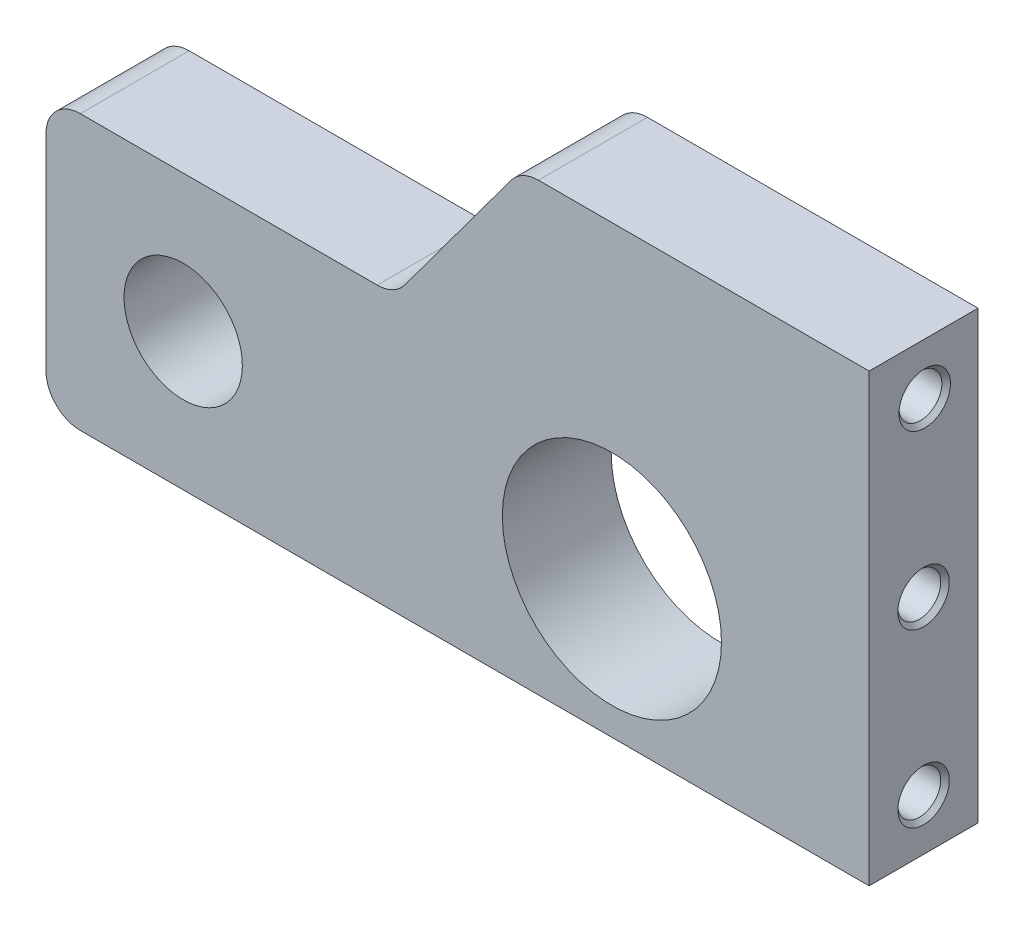
ISO-10303-21;
HEADER;
FILE_DESCRIPTION(('STEP AP214'),'2;1');
FILE_NAME('part.step','',(''),(''),'','','');
FILE_SCHEMA(('AUTOMOTIVE_DESIGN { 1 0 10303 214 1 1 1 1 }'));
ENDSEC;
DATA;
#1=APPLICATION_CONTEXT('core data for automotive mechanical design processes');
#2=APPLICATION_PROTOCOL_DEFINITION('international standard','automotive_design',2000,#1);
#3=PRODUCT_CONTEXT('',#1,'mechanical');
#4=PRODUCT('Part','Part','',(#3));
#5=PRODUCT_RELATED_PRODUCT_CATEGORY('part','',(#4));
#6=PRODUCT_DEFINITION_FORMATION('','',#4);
#7=PRODUCT_DEFINITION_CONTEXT('part definition',#1,'design');
#8=PRODUCT_DEFINITION('design','',#6,#7);
#9=PRODUCT_DEFINITION_SHAPE('','',#8);
#10=(LENGTH_UNIT() NAMED_UNIT(*) SI_UNIT(.MILLI.,.METRE.));
#11=(NAMED_UNIT(*) PLANE_ANGLE_UNIT() SI_UNIT($,.RADIAN.));
#12=(NAMED_UNIT(*) SI_UNIT($,.STERADIAN.) SOLID_ANGLE_UNIT());
#13=UNCERTAINTY_MEASURE_WITH_UNIT(LENGTH_MEASURE(1.E-05),#10,'distance_accuracy_value','');
#14=(GEOMETRIC_REPRESENTATION_CONTEXT(3) GLOBAL_UNCERTAINTY_ASSIGNED_CONTEXT((#13)) GLOBAL_UNIT_ASSIGNED_CONTEXT((#10,
#11,#12)) REPRESENTATION_CONTEXT('',''));
#15=CARTESIAN_POINT('',(0.,0.,0.));
#16=DIRECTION('',(0.,0.,1.));
#17=DIRECTION('',(1.,0.,0.));
#18=AXIS2_PLACEMENT_3D('',#15,#16,#17);
#19=CARTESIAN_POINT('',(0.,0.,6.35));
#20=DIRECTION('',(-1.,0.,0.));
#21=DIRECTION('',(0.,-1.,0.));
#22=AXIS2_PLACEMENT_3D('',#19,#20,#21);
#23=PLANE('',#22);
#24=DIRECTION('',(0.,1.,0.));
#25=VECTOR('',#24,1.);
#26=CARTESIAN_POINT('',(0.,0.,6.35));
#27=LINE('',#26,#25);
#28=CARTESIAN_POINT('',(0.,2.,6.35));
#29=VERTEX_POINT('',#28);
#30=CARTESIAN_POINT('',(0.,14.,6.35));
#31=VERTEX_POINT('',#30);
#32=EDGE_CURVE('E204',#29,#31,#27,.T.);
#33=ORIENTED_EDGE('',*,*,#32,.T.);
#34=DIRECTION('',(0.,0.,-1.));
#35=VECTOR('',#34,1.);
#36=CARTESIAN_POINT('',(0.,14.,6.35));
#37=LINE('',#36,#35);
#38=CARTESIAN_POINT('',(0.,14.,0.));
#39=VERTEX_POINT('',#38);
#40=EDGE_CURVE('E231',#31,#39,#37,.T.);
#41=ORIENTED_EDGE('',*,*,#40,.T.);
#42=DIRECTION('',(0.,1.,0.));
#43=VECTOR('',#42,1.);
#44=CARTESIAN_POINT('',(0.,0.,0.));
#45=LINE('',#44,#43);
#46=CARTESIAN_POINT('',(0.,2.,0.));
#47=VERTEX_POINT('',#46);
#48=EDGE_CURVE('E192',#47,#39,#45,.T.);
#49=ORIENTED_EDGE('',*,*,#48,.F.);
#50=DIRECTION('',(0.,0.,-1.));
#51=VECTOR('',#50,1.);
#52=CARTESIAN_POINT('',(0.,2.,6.35));
#53=LINE('',#52,#51);
#54=EDGE_CURVE('E228',#47,#29,#53,.F.);
#55=ORIENTED_EDGE('',*,*,#54,.T.);
#56=EDGE_LOOP('',(#33,#41,#49,#55));
#57=FACE_BOUND('',#56,.T.);
#58=ADVANCED_FACE('F66',(#57),#23,.T.);
#59=CARTESIAN_POINT('',(0.,0.,6.35));
#60=DIRECTION('',(0.,1.,0.));
#61=DIRECTION('',(-1.,0.,0.));
#62=AXIS2_PLACEMENT_3D('',#59,#60,#61);
#63=PLANE('',#62);
#64=DIRECTION('',(1.,0.,0.));
#65=VECTOR('',#64,1.);
#66=CARTESIAN_POINT('',(0.,0.,6.35));
#67=LINE('',#66,#65);
#68=CARTESIAN_POINT('',(2.,0.,6.35));
#69=VERTEX_POINT('',#68);
#70=CARTESIAN_POINT('',(48.,0.,6.35));
#71=VERTEX_POINT('',#70);
#72=EDGE_CURVE('E215',#69,#71,#67,.T.);
#73=ORIENTED_EDGE('',*,*,#72,.F.);
#74=DIRECTION('',(0.,0.,-1.));
#75=VECTOR('',#74,1.);
#76=CARTESIAN_POINT('',(2.,0.,0.));
#77=LINE('',#76,#75);
#78=CARTESIAN_POINT('',(2.,0.,0.));
#79=VERTEX_POINT('',#78);
#80=EDGE_CURVE('E250',#69,#79,#77,.T.);
#81=ORIENTED_EDGE('',*,*,#80,.T.);
#82=DIRECTION('',(1.,0.,0.));
#83=VECTOR('',#82,1.);
#84=CARTESIAN_POINT('',(0.,0.,0.));
#85=LINE('',#84,#83);
#86=CARTESIAN_POINT('',(48.,0.,0.));
#87=VERTEX_POINT('',#86);
#88=EDGE_CURVE('E158',#79,#87,#85,.T.);
#89=ORIENTED_EDGE('',*,*,#88,.T.);
#90=DIRECTION('',(0.,0.,-1.));
#91=VECTOR('',#90,1.);
#92=CARTESIAN_POINT('',(48.,0.,6.35));
#93=LINE('',#92,#91);
#94=EDGE_CURVE('E155',#71,#87,#93,.T.);
#95=ORIENTED_EDGE('',*,*,#94,.F.);
#96=EDGE_LOOP('',(#73,#81,#89,#95));
#97=FACE_BOUND('',#96,.T.);
#98=ADVANCED_FACE('F313',(#97),#63,.F.);
#99=CARTESIAN_POINT('',(48.,0.,6.35));
#100=DIRECTION('',(-1.,0.,0.));
#101=DIRECTION('',(0.,0.,1.));
#102=AXIS2_PLACEMENT_3D('',#99,#100,#101);
#103=PLANE('',#102);
#104=CARTESIAN_POINT('',(48.,3.,3.175));
#105=DIRECTION('',(-1.,0.,0.));
#106=DIRECTION('',(0.,0.,1.));
#107=AXIS2_PLACEMENT_3D('',#104,#105,#106);
#108=CIRCLE('',#107,1.5);
#109=CARTESIAN_POINT('',(48.,3.,4.675));
#110=VERTEX_POINT('',#109);
#111=EDGE_CURVE('E289',#110,#110,#108,.T.);
#112=ORIENTED_EDGE('',*,*,#111,.T.);
#113=EDGE_LOOP('',(#112));
#114=FACE_BOUND('',#113,.T.);
#115=CARTESIAN_POINT('',(48.,13.,3.175));
#116=DIRECTION('',(-1.,0.,0.));
#117=DIRECTION('',(0.,0.,1.));
#118=AXIS2_PLACEMENT_3D('',#115,#116,#117);
#119=CIRCLE('',#118,1.5);
#120=CARTESIAN_POINT('',(48.,13.,4.675));
#121=VERTEX_POINT('',#120);
#122=EDGE_CURVE('E285',#121,#121,#119,.T.);
#123=ORIENTED_EDGE('',*,*,#122,.T.);
#124=EDGE_LOOP('',(#123));
#125=FACE_BOUND('',#124,.T.);
#126=CARTESIAN_POINT('',(48.,23.,3.10572404048079));
#127=DIRECTION('',(-1.,0.,0.));
#128=DIRECTION('',(0.,0.,1.));
#129=AXIS2_PLACEMENT_3D('',#126,#127,#128);
#130=CIRCLE('',#129,1.5);
#131=CARTESIAN_POINT('',(48.,23.,4.6057240404808));
#132=VERTEX_POINT('',#131);
#133=EDGE_CURVE('E281',#132,#132,#130,.T.);
#134=ORIENTED_EDGE('',*,*,#133,.T.);
#135=EDGE_LOOP('',(#134));
#136=FACE_BOUND('',#135,.T.);
#137=DIRECTION('',(0.,1.,0.));
#138=VECTOR('',#137,1.);
#139=CARTESIAN_POINT('',(48.,0.,0.));
#140=LINE('',#139,#138);
#141=CARTESIAN_POINT('',(48.,26.,0.));
#142=VERTEX_POINT('',#141);
#143=EDGE_CURVE('E148',#87,#142,#140,.T.);
#144=ORIENTED_EDGE('',*,*,#143,.T.);
#145=DIRECTION('',(0.,0.,1.));
#146=VECTOR('',#145,1.);
#147=CARTESIAN_POINT('',(48.,26.,0.));
#148=LINE('',#147,#146);
#149=CARTESIAN_POINT('',(48.,26.,6.35));
#150=VERTEX_POINT('',#149);
#151=EDGE_CURVE('E152',#142,#150,#148,.T.);
#152=ORIENTED_EDGE('',*,*,#151,.T.);
#153=DIRECTION('',(0.,1.,0.));
#154=VECTOR('',#153,1.);
#155=CARTESIAN_POINT('',(48.,0.,6.35));
#156=LINE('',#155,#154);
#157=EDGE_CURVE('E212',#71,#150,#156,.T.);
#158=ORIENTED_EDGE('',*,*,#157,.F.);
#159=ORIENTED_EDGE('',*,*,#94,.T.);
#160=EDGE_LOOP('',(#144,#152,#158,#159));
#161=FACE_BOUND('',#160,.T.);
#162=ADVANCED_FACE('F150',(#114,#125,#136,#161),#103,.F.);
#163=CARTESIAN_POINT('',(0.,16.,6.35));
#164=DIRECTION('',(0.,1.,0.));
#165=DIRECTION('',(-1.,0.,0.));
#166=AXIS2_PLACEMENT_3D('',#163,#164,#165);
#167=PLANE('',#166);
#168=DIRECTION('',(1.,0.,0.));
#169=VECTOR('',#168,1.);
#170=CARTESIAN_POINT('',(0.,16.,6.35));
#171=LINE('',#170,#169);
#172=CARTESIAN_POINT('',(2.00000000000001,16.,6.35));
#173=VERTEX_POINT('',#172);
#174=CARTESIAN_POINT('',(19.3170754387709,16.,6.35));
#175=VERTEX_POINT('',#174);
#176=EDGE_CURVE('E208',#173,#175,#171,.T.);
#177=ORIENTED_EDGE('',*,*,#176,.T.);
#178=DIRECTION('',(0.,0.,1.));
#179=VECTOR('',#178,1.);
#180=CARTESIAN_POINT('',(19.3170754387709,16.,0.));
#181=LINE('',#180,#179);
#182=CARTESIAN_POINT('',(19.3170754387709,16.,0.));
#183=VERTEX_POINT('',#182);
#184=EDGE_CURVE('E261',#175,#183,#181,.F.);
#185=ORIENTED_EDGE('',*,*,#184,.T.);
#186=DIRECTION('',(1.,0.,0.));
#187=VECTOR('',#186,1.);
#188=CARTESIAN_POINT('',(0.,16.,0.));
#189=LINE('',#188,#187);
#190=CARTESIAN_POINT('',(2.00000000000001,16.,0.));
#191=VERTEX_POINT('',#190);
#192=EDGE_CURVE('E159',#191,#183,#189,.T.);
#193=ORIENTED_EDGE('',*,*,#192,.F.);
#194=DIRECTION('',(0.,0.,-1.));
#195=VECTOR('',#194,1.);
#196=CARTESIAN_POINT('',(2.00000000000001,16.,6.35));
#197=LINE('',#196,#195);
#198=EDGE_CURVE('E241',#191,#173,#197,.F.);
#199=ORIENTED_EDGE('',*,*,#198,.T.);
#200=EDGE_LOOP('',(#177,#185,#193,#199));
#201=FACE_BOUND('',#200,.T.);
#202=ADVANCED_FACE('F323',(#201),#167,.T.);
#203=CARTESIAN_POINT('',(0.,0.,6.35));
#204=DIRECTION('',(0.,0.,-1.));
#205=DIRECTION('',(-1.,0.,0.));
#206=AXIS2_PLACEMENT_3D('',#203,#204,#205);
#207=PLANE('',#206);
#208=CARTESIAN_POINT('',(8.,8.,6.35));
#209=DIRECTION('',(0.,0.,1.));
#210=DIRECTION('',(1.,0.,0.));
#211=AXIS2_PLACEMENT_3D('',#208,#209,#210);
#212=CIRCLE('',#211,3.45);
#213=CARTESIAN_POINT('',(11.45,8.,6.35));
#214=VERTEX_POINT('',#213);
#215=EDGE_CURVE('E188',#214,#214,#212,.T.);
#216=ORIENTED_EDGE('',*,*,#215,.F.);
#217=EDGE_LOOP('',(#216));
#218=FACE_BOUND('',#217,.T.);
#219=CARTESIAN_POINT('',(33.,7.99999999999999,6.35));
#220=DIRECTION('',(0.,0.,1.));
#221=DIRECTION('',(1.,0.,0.));
#222=AXIS2_PLACEMENT_3D('',#219,#220,#221);
#223=CIRCLE('',#222,6.39);
#224=CARTESIAN_POINT('',(39.39,7.99999999999999,6.35));
#225=VERTEX_POINT('',#224);
#226=EDGE_CURVE('E182',#225,#225,#223,.T.);
#227=ORIENTED_EDGE('',*,*,#226,.F.);
#228=EDGE_LOOP('',(#227));
#229=FACE_BOUND('',#228,.T.);
#230=DIRECTION('',(-1.,0.,0.));
#231=VECTOR('',#230,1.);
#232=CARTESIAN_POINT('',(48.,26.,6.35));
#233=LINE('',#232,#231);
#234=CARTESIAN_POINT('',(28.7212493815809,26.,6.35));
#235=VERTEX_POINT('',#234);
#236=EDGE_CURVE('E165',#150,#235,#233,.T.);
#237=ORIENTED_EDGE('',*,*,#236,.T.);
#238=CARTESIAN_POINT('',(28.7212493815809,24.,6.35));
#239=DIRECTION('',(0.,0.,-1.));
#240=DIRECTION('',(-1.,0.,0.));
#241=AXIS2_PLACEMENT_3D('',#238,#239,#240);
#242=CIRCLE('',#241,2.);
#243=CARTESIAN_POINT('',(27.112470955428,25.1882053591636,6.35));
#244=VERTEX_POINT('',#243);
#245=EDGE_CURVE('E90',#235,#244,#242,.F.);
#246=ORIENTED_EDGE('',*,*,#245,.T.);
#247=DIRECTION('',(-0.594102679581803,-0.804389213076432,0.));
#248=VECTOR('',#247,1.);
#249=CARTESIAN_POINT('',(5.50572150582795,-4.06639453447363,6.35));
#250=LINE('',#249,#248);
#251=CARTESIAN_POINT('',(20.9258538649237,16.8117946408364,6.35));
#252=VERTEX_POINT('',#251);
#253=EDGE_CURVE('E167',#244,#252,#250,.T.);
#254=ORIENTED_EDGE('',*,*,#253,.T.);
#255=CARTESIAN_POINT('',(19.3170754387709,18.,6.35));
#256=DIRECTION('',(0.,0.,-1.));
#257=DIRECTION('',(-1.,0.,0.));
#258=AXIS2_PLACEMENT_3D('',#255,#256,#257);
#259=CIRCLE('',#258,2.);
#260=EDGE_CURVE('E271',#252,#175,#259,.T.);
#261=ORIENTED_EDGE('',*,*,#260,.T.);
#262=ORIENTED_EDGE('',*,*,#176,.F.);
#263=CARTESIAN_POINT('',(2.,14.,6.35));
#264=DIRECTION('',(0.,0.,-1.));
#265=DIRECTION('',(-1.,0.,0.));
#266=AXIS2_PLACEMENT_3D('',#263,#264,#265);
#267=CIRCLE('',#266,2.);
#268=EDGE_CURVE('E247',#173,#31,#267,.F.);
#269=ORIENTED_EDGE('',*,*,#268,.T.);
#270=ORIENTED_EDGE('',*,*,#32,.F.);
#271=CARTESIAN_POINT('',(2.,2.,6.35));
#272=DIRECTION('',(0.,0.,-1.));
#273=DIRECTION('',(-1.,0.,0.));
#274=AXIS2_PLACEMENT_3D('',#271,#272,#273);
#275=CIRCLE('',#274,2.);
#276=EDGE_CURVE('E244',#29,#69,#275,.F.);
#277=ORIENTED_EDGE('',*,*,#276,.T.);
#278=ORIENTED_EDGE('',*,*,#72,.T.);
#279=ORIENTED_EDGE('',*,*,#157,.T.);
#280=EDGE_LOOP('',(#237,#246,#254,#261,#262,#269,#270,#277,#278,#279));
#281=FACE_BOUND('',#280,.T.);
#282=ADVANCED_FACE('F349',(#218,#229,#281),#207,.F.);
#283=CARTESIAN_POINT('',(0.,0.,0.));
#284=DIRECTION('',(0.,0.,-1.));
#285=DIRECTION('',(-1.,0.,0.));
#286=AXIS2_PLACEMENT_3D('',#283,#284,#285);
#287=PLANE('',#286);
#288=CARTESIAN_POINT('',(8.,8.,0.));
#289=DIRECTION('',(0.,0.,1.));
#290=DIRECTION('',(1.,0.,0.));
#291=AXIS2_PLACEMENT_3D('',#288,#289,#290);
#292=CIRCLE('',#291,3.45);
#293=CARTESIAN_POINT('',(11.45,8.,0.));
#294=VERTEX_POINT('',#293);
#295=EDGE_CURVE('E193',#294,#294,#292,.T.);
#296=ORIENTED_EDGE('',*,*,#295,.T.);
#297=EDGE_LOOP('',(#296));
#298=FACE_BOUND('',#297,.T.);
#299=CARTESIAN_POINT('',(33.,7.99999999999999,0.));
#300=DIRECTION('',(0.,0.,1.));
#301=DIRECTION('',(1.,0.,0.));
#302=AXIS2_PLACEMENT_3D('',#299,#300,#301);
#303=CIRCLE('',#302,6.39);
#304=CARTESIAN_POINT('',(39.39,7.99999999999999,0.));
#305=VERTEX_POINT('',#304);
#306=EDGE_CURVE('E197',#305,#305,#303,.T.);
#307=ORIENTED_EDGE('',*,*,#306,.T.);
#308=EDGE_LOOP('',(#307));
#309=FACE_BOUND('',#308,.T.);
#310=DIRECTION('',(-0.594102679581803,-0.804389213076432,0.));
#311=VECTOR('',#310,1.);
#312=CARTESIAN_POINT('',(5.50572150582795,-4.06639453447363,0.));
#313=LINE('',#312,#311);
#314=CARTESIAN_POINT('',(27.112470955428,25.1882053591636,0.));
#315=VERTEX_POINT('',#314);
#316=CARTESIAN_POINT('',(20.9258538649237,16.8117946408364,0.));
#317=VERTEX_POINT('',#316);
#318=EDGE_CURVE('E187',#315,#317,#313,.T.);
#319=ORIENTED_EDGE('',*,*,#318,.F.);
#320=CARTESIAN_POINT('',(28.7212493815809,24.,0.));
#321=DIRECTION('',(0.,0.,-1.));
#322=DIRECTION('',(-1.,0.,0.));
#323=AXIS2_PLACEMENT_3D('',#320,#321,#322);
#324=CIRCLE('',#323,2.);
#325=CARTESIAN_POINT('',(28.7212493815809,26.,0.));
#326=VERTEX_POINT('',#325);
#327=EDGE_CURVE('E82',#315,#326,#324,.T.);
#328=ORIENTED_EDGE('',*,*,#327,.T.);
#329=DIRECTION('',(-1.,0.,0.));
#330=VECTOR('',#329,1.);
#331=CARTESIAN_POINT('',(48.,26.,0.));
#332=LINE('',#331,#330);
#333=EDGE_CURVE('E163',#142,#326,#332,.T.);
#334=ORIENTED_EDGE('',*,*,#333,.F.);
#335=ORIENTED_EDGE('',*,*,#143,.F.);
#336=ORIENTED_EDGE('',*,*,#88,.F.);
#337=CARTESIAN_POINT('',(2.,2.,0.));
#338=DIRECTION('',(0.,0.,-1.));
#339=DIRECTION('',(-1.,0.,0.));
#340=AXIS2_PLACEMENT_3D('',#337,#338,#339);
#341=CIRCLE('',#340,2.);
#342=EDGE_CURVE('E235',#79,#47,#341,.T.);
#343=ORIENTED_EDGE('',*,*,#342,.T.);
#344=ORIENTED_EDGE('',*,*,#48,.T.);
#345=CARTESIAN_POINT('',(2.,14.,0.));
#346=DIRECTION('',(0.,0.,-1.));
#347=DIRECTION('',(-1.,0.,0.));
#348=AXIS2_PLACEMENT_3D('',#345,#346,#347);
#349=CIRCLE('',#348,2.);
#350=EDGE_CURVE('E238',#39,#191,#349,.T.);
#351=ORIENTED_EDGE('',*,*,#350,.T.);
#352=ORIENTED_EDGE('',*,*,#192,.T.);
#353=CARTESIAN_POINT('',(19.3170754387709,18.,0.));
#354=DIRECTION('',(0.,0.,-1.));
#355=DIRECTION('',(-1.,0.,0.));
#356=AXIS2_PLACEMENT_3D('',#353,#354,#355);
#357=CIRCLE('',#356,2.);
#358=EDGE_CURVE('E274',#183,#317,#357,.F.);
#359=ORIENTED_EDGE('',*,*,#358,.T.);
#360=EDGE_LOOP('',(#319,#328,#334,#335,#336,#343,#344,#351,#352,#359));
#361=FACE_BOUND('',#360,.T.);
#362=ADVANCED_FACE('F169',(#298,#309,#361),#287,.T.);
#363=CARTESIAN_POINT('',(33.,7.99999999999999,6.35));
#364=DIRECTION('',(0.,0.,-1.));
#365=DIRECTION('',(-1.,0.,0.));
#366=AXIS2_PLACEMENT_3D('',#363,#364,#365);
#367=CYLINDRICAL_SURFACE('',#366,6.39);
#368=ORIENTED_EDGE('',*,*,#226,.T.);
#369=EDGE_LOOP('',(#368));
#370=FACE_BOUND('',#369,.T.);
#371=ORIENTED_EDGE('',*,*,#306,.F.);
#372=EDGE_LOOP('',(#371));
#373=FACE_BOUND('',#372,.T.);
#374=ADVANCED_FACE('F401',(#370,#373),#367,.F.);
#375=CARTESIAN_POINT('',(8.,8.,6.35));
#376=DIRECTION('',(0.,0.,-1.));
#377=DIRECTION('',(-1.,0.,0.));
#378=AXIS2_PLACEMENT_3D('',#375,#376,#377);
#379=CYLINDRICAL_SURFACE('',#378,3.45);
#380=ORIENTED_EDGE('',*,*,#215,.T.);
#381=EDGE_LOOP('',(#380));
#382=FACE_BOUND('',#381,.T.);
#383=ORIENTED_EDGE('',*,*,#295,.F.);
#384=EDGE_LOOP('',(#383));
#385=FACE_BOUND('',#384,.T.);
#386=ADVANCED_FACE('F329',(#382,#385),#379,.F.);
#387=CARTESIAN_POINT('',(2.,14.,6.35));
#388=DIRECTION('',(0.,0.,-1.));
#389=DIRECTION('',(-1.,0.,0.));
#390=AXIS2_PLACEMENT_3D('',#387,#388,#389);
#391=CYLINDRICAL_SURFACE('',#390,2.);
#392=ORIENTED_EDGE('',*,*,#268,.F.);
#393=ORIENTED_EDGE('',*,*,#198,.F.);
#394=ORIENTED_EDGE('',*,*,#350,.F.);
#395=ORIENTED_EDGE('',*,*,#40,.F.);
#396=EDGE_LOOP('',(#392,#393,#394,#395));
#397=FACE_BOUND('',#396,.T.);
#398=ADVANCED_FACE('F325',(#397),#391,.T.);
#399=CARTESIAN_POINT('',(2.,2.,6.35));
#400=DIRECTION('',(0.,0.,1.));
#401=DIRECTION('',(1.,0.,0.));
#402=AXIS2_PLACEMENT_3D('',#399,#400,#401);
#403=CYLINDRICAL_SURFACE('',#402,2.);
#404=ORIENTED_EDGE('',*,*,#276,.F.);
#405=ORIENTED_EDGE('',*,*,#54,.F.);
#406=ORIENTED_EDGE('',*,*,#342,.F.);
#407=ORIENTED_EDGE('',*,*,#80,.F.);
#408=EDGE_LOOP('',(#404,#405,#406,#407));
#409=FACE_BOUND('',#408,.T.);
#410=ADVANCED_FACE('F328',(#409),#403,.T.);
#411=CARTESIAN_POINT('',(43.,3.,3.175));
#412=DIRECTION('',(1.,0.,0.));
#413=DIRECTION('',(0.,0.,-1.));
#414=AXIS2_PLACEMENT_3D('',#411,#412,#413);
#415=CYLINDRICAL_SURFACE('',#414,1.25);
#416=CARTESIAN_POINT('',(47.75,3.,3.175));
#417=DIRECTION('',(-1.,0.,0.));
#418=DIRECTION('',(0.,0.,1.));
#419=AXIS2_PLACEMENT_3D('',#416,#417,#418);
#420=CIRCLE('',#419,1.25);
#421=CARTESIAN_POINT('',(47.75,3.,4.425));
#422=VERTEX_POINT('',#421);
#423=EDGE_CURVE('E277',#422,#422,#420,.F.);
#424=ORIENTED_EDGE('',*,*,#423,.T.);
#425=EDGE_LOOP('',(#424));
#426=FACE_BOUND('',#425,.T.);
#427=CARTESIAN_POINT('',(43.,3.,3.175));
#428=DIRECTION('',(1.,0.,0.));
#429=DIRECTION('',(0.,0.,-1.));
#430=AXIS2_PLACEMENT_3D('',#427,#428,#429);
#431=CIRCLE('',#430,1.25);
#432=CARTESIAN_POINT('',(43.,3.,1.925));
#433=VERTEX_POINT('',#432);
#434=EDGE_CURVE('E183',#433,#433,#431,.T.);
#435=ORIENTED_EDGE('',*,*,#434,.F.);
#436=EDGE_LOOP('',(#435));
#437=FACE_BOUND('',#436,.T.);
#438=ADVANCED_FACE('F333',(#426,#437),#415,.F.);
#439=CARTESIAN_POINT('',(43.,3.,3.175));
#440=DIRECTION('',(1.,0.,0.));
#441=DIRECTION('',(0.,0.,-1.));
#442=AXIS2_PLACEMENT_3D('',#439,#440,#441);
#443=PLANE('',#442);
#444=ORIENTED_EDGE('',*,*,#434,.T.);
#445=EDGE_LOOP('',(#444));
#446=FACE_BOUND('',#445,.T.);
#447=ADVANCED_FACE('F392',(#446),#443,.T.);
#448=CARTESIAN_POINT('',(43.,13.,3.175));
#449=DIRECTION('',(1.,0.,0.));
#450=DIRECTION('',(0.,0.,-1.));
#451=AXIS2_PLACEMENT_3D('',#448,#449,#450);
#452=CYLINDRICAL_SURFACE('',#451,1.25);
#453=CARTESIAN_POINT('',(47.75,13.,3.175));
#454=DIRECTION('',(-1.,0.,0.));
#455=DIRECTION('',(0.,0.,1.));
#456=AXIS2_PLACEMENT_3D('',#453,#454,#455);
#457=CIRCLE('',#456,1.25);
#458=CARTESIAN_POINT('',(47.75,13.,4.425));
#459=VERTEX_POINT('',#458);
#460=EDGE_CURVE('E75',#459,#459,#457,.F.);
#461=ORIENTED_EDGE('',*,*,#460,.T.);
#462=EDGE_LOOP('',(#461));
#463=FACE_BOUND('',#462,.T.);
#464=CARTESIAN_POINT('',(43.,13.,3.175));
#465=DIRECTION('',(1.,0.,0.));
#466=DIRECTION('',(0.,0.,-1.));
#467=AXIS2_PLACEMENT_3D('',#464,#465,#466);
#468=CIRCLE('',#467,1.25);
#469=CARTESIAN_POINT('',(43.,13.,1.925));
#470=VERTEX_POINT('',#469);
#471=EDGE_CURVE('E178',#470,#470,#468,.T.);
#472=ORIENTED_EDGE('',*,*,#471,.F.);
#473=EDGE_LOOP('',(#472));
#474=FACE_BOUND('',#473,.T.);
#475=ADVANCED_FACE('F296',(#463,#474),#452,.F.);
#476=CARTESIAN_POINT('',(43.,13.,3.175));
#477=DIRECTION('',(1.,0.,0.));
#478=DIRECTION('',(0.,0.,-1.));
#479=AXIS2_PLACEMENT_3D('',#476,#477,#478);
#480=PLANE('',#479);
#481=ORIENTED_EDGE('',*,*,#471,.T.);
#482=EDGE_LOOP('',(#481));
#483=FACE_BOUND('',#482,.T.);
#484=ADVANCED_FACE('F384',(#483),#480,.T.);
#485=CARTESIAN_POINT('',(5.50572150582795,-4.06639453447363,0.));
#486=DIRECTION('',(-0.804389213076432,0.594102679581803,0.));
#487=DIRECTION('',(-0.594102679581803,-0.804389213076432,0.));
#488=AXIS2_PLACEMENT_3D('',#485,#486,#487);
#489=PLANE('',#488);
#490=ORIENTED_EDGE('',*,*,#318,.T.);
#491=DIRECTION('',(0.,0.,1.));
#492=VECTOR('',#491,1.);
#493=CARTESIAN_POINT('',(20.9258538649237,16.8117946408364,6.35));
#494=LINE('',#493,#492);
#495=EDGE_CURVE('E257',#317,#252,#494,.T.);
#496=ORIENTED_EDGE('',*,*,#495,.T.);
#497=ORIENTED_EDGE('',*,*,#253,.F.);
#498=DIRECTION('',(0.,0.,1.));
#499=VECTOR('',#498,1.);
#500=CARTESIAN_POINT('',(27.112470955428,25.1882053591636,0.));
#501=LINE('',#500,#499);
#502=EDGE_CURVE('E254',#244,#315,#501,.F.);
#503=ORIENTED_EDGE('',*,*,#502,.T.);
#504=EDGE_LOOP('',(#490,#496,#497,#503));
#505=FACE_BOUND('',#504,.T.);
#506=ADVANCED_FACE('F340',(#505),#489,.T.);
#507=CARTESIAN_POINT('',(48.,26.,0.));
#508=DIRECTION('',(0.,1.,0.));
#509=DIRECTION('',(0.,0.,1.));
#510=AXIS2_PLACEMENT_3D('',#507,#508,#509);
#511=PLANE('',#510);
#512=ORIENTED_EDGE('',*,*,#333,.T.);
#513=DIRECTION('',(0.,0.,1.));
#514=VECTOR('',#513,1.);
#515=CARTESIAN_POINT('',(28.7212493815809,26.,0.));
#516=LINE('',#515,#514);
#517=EDGE_CURVE('E264',#326,#235,#516,.T.);
#518=ORIENTED_EDGE('',*,*,#517,.T.);
#519=ORIENTED_EDGE('',*,*,#236,.F.);
#520=ORIENTED_EDGE('',*,*,#151,.F.);
#521=EDGE_LOOP('',(#512,#518,#519,#520));
#522=FACE_BOUND('',#521,.T.);
#523=ADVANCED_FACE('F162',(#522),#511,.T.);
#524=CARTESIAN_POINT('',(19.3170754387709,18.,0.));
#525=DIRECTION('',(0.,0.,-1.));
#526=DIRECTION('',(-1.,0.,0.));
#527=AXIS2_PLACEMENT_3D('',#524,#525,#526);
#528=CYLINDRICAL_SURFACE('',#527,2.);
#529=ORIENTED_EDGE('',*,*,#358,.F.);
#530=ORIENTED_EDGE('',*,*,#184,.F.);
#531=ORIENTED_EDGE('',*,*,#260,.F.);
#532=ORIENTED_EDGE('',*,*,#495,.F.);
#533=EDGE_LOOP('',(#529,#530,#531,#532));
#534=FACE_BOUND('',#533,.T.);
#535=ADVANCED_FACE('F335',(#534),#528,.F.);
#536=CARTESIAN_POINT('',(28.7212493815809,24.,0.));
#537=DIRECTION('',(0.,0.,1.));
#538=DIRECTION('',(1.,0.,0.));
#539=AXIS2_PLACEMENT_3D('',#536,#537,#538);
#540=CYLINDRICAL_SURFACE('',#539,2.);
#541=ORIENTED_EDGE('',*,*,#327,.F.);
#542=ORIENTED_EDGE('',*,*,#502,.F.);
#543=ORIENTED_EDGE('',*,*,#245,.F.);
#544=ORIENTED_EDGE('',*,*,#517,.F.);
#545=EDGE_LOOP('',(#541,#542,#543,#544));
#546=FACE_BOUND('',#545,.T.);
#547=ADVANCED_FACE('F338',(#546),#540,.T.);
#548=CARTESIAN_POINT('',(43.,23.,3.10572404048079));
#549=DIRECTION('',(1.,0.,0.));
#550=DIRECTION('',(0.,0.,-1.));
#551=AXIS2_PLACEMENT_3D('',#548,#549,#550);
#552=CYLINDRICAL_SURFACE('',#551,1.25);
#553=CARTESIAN_POINT('',(47.75,23.,3.10572404048079));
#554=DIRECTION('',(-1.,0.,0.));
#555=DIRECTION('',(0.,0.,1.));
#556=AXIS2_PLACEMENT_3D('',#553,#554,#555);
#557=CIRCLE('',#556,1.25);
#558=CARTESIAN_POINT('',(47.75,23.,4.3557240404808));
#559=VERTEX_POINT('',#558);
#560=EDGE_CURVE('E12',#559,#559,#557,.F.);
#561=ORIENTED_EDGE('',*,*,#560,.T.);
#562=EDGE_LOOP('',(#561));
#563=FACE_BOUND('',#562,.T.);
#564=CARTESIAN_POINT('',(43.,23.,3.10572404048079));
#565=DIRECTION('',(1.,0.,0.));
#566=DIRECTION('',(0.,0.,-1.));
#567=AXIS2_PLACEMENT_3D('',#564,#565,#566);
#568=CIRCLE('',#567,1.25);
#569=CARTESIAN_POINT('',(43.,23.,1.85572404048079));
#570=VERTEX_POINT('',#569);
#571=EDGE_CURVE('E173',#570,#570,#568,.T.);
#572=ORIENTED_EDGE('',*,*,#571,.F.);
#573=EDGE_LOOP('',(#572));
#574=FACE_BOUND('',#573,.T.);
#575=ADVANCED_FACE('F342',(#563,#574),#552,.F.);
#576=CARTESIAN_POINT('',(43.,23.,3.10572404048079));
#577=DIRECTION('',(1.,0.,0.));
#578=DIRECTION('',(0.,0.,-1.));
#579=AXIS2_PLACEMENT_3D('',#576,#577,#578);
#580=PLANE('',#579);
#581=ORIENTED_EDGE('',*,*,#571,.T.);
#582=EDGE_LOOP('',(#581));
#583=FACE_BOUND('',#582,.T.);
#584=ADVANCED_FACE('F308',(#583),#580,.T.);
#585=CARTESIAN_POINT('',(47.75,3.,3.175));
#586=DIRECTION('',(1.,0.,0.));
#587=DIRECTION('',(0.,0.,-1.));
#588=AXIS2_PLACEMENT_3D('',#585,#586,#587);
#589=CONICAL_SURFACE('',#588,1.25,0.78539816339745);
#590=ORIENTED_EDGE('',*,*,#111,.F.);
#591=EDGE_LOOP('',(#590));
#592=FACE_BOUND('',#591,.T.);
#593=ORIENTED_EDGE('',*,*,#423,.F.);
#594=EDGE_LOOP('',(#593));
#595=FACE_BOUND('',#594,.T.);
#596=ADVANCED_FACE('F301',(#592,#595),#589,.F.);
#597=CARTESIAN_POINT('',(47.75,13.,3.175));
#598=DIRECTION('',(1.,0.,0.));
#599=DIRECTION('',(0.,0.,-1.));
#600=AXIS2_PLACEMENT_3D('',#597,#598,#599);
#601=CONICAL_SURFACE('',#600,1.25,0.785398163397437);
#602=ORIENTED_EDGE('',*,*,#122,.F.);
#603=EDGE_LOOP('',(#602));
#604=FACE_BOUND('',#603,.T.);
#605=ORIENTED_EDGE('',*,*,#460,.F.);
#606=EDGE_LOOP('',(#605));
#607=FACE_BOUND('',#606,.T.);
#608=ADVANCED_FACE('F299',(#604,#607),#601,.F.);
#609=CARTESIAN_POINT('',(47.75,23.,3.10572404048079));
#610=DIRECTION('',(1.,0.,0.));
#611=DIRECTION('',(0.,0.,-1.));
#612=AXIS2_PLACEMENT_3D('',#609,#610,#611);
#613=CONICAL_SURFACE('',#612,1.25,0.78539816339745);
#614=ORIENTED_EDGE('',*,*,#133,.F.);
#615=EDGE_LOOP('',(#614));
#616=FACE_BOUND('',#615,.T.);
#617=ORIENTED_EDGE('',*,*,#560,.F.);
#618=EDGE_LOOP('',(#617));
#619=FACE_BOUND('',#618,.T.);
#620=ADVANCED_FACE('F68',(#616,#619),#613,.F.);
#621=CLOSED_SHELL('',(#58,#98,#162,#202,#282,#362,#374,#386,#398,#410,#438,#447,#475,#484,#506,
#523,#535,#547,#575,#584,#596,#608,#620));
#622=MANIFOLD_SOLID_BREP('B2',#621);
#623=ADVANCED_BREP_SHAPE_REPRESENTATION('',(#18,#622),#14);
#624=SHAPE_DEFINITION_REPRESENTATION(#9,#623);
ENDSEC;
END-ISO-10303-21;
